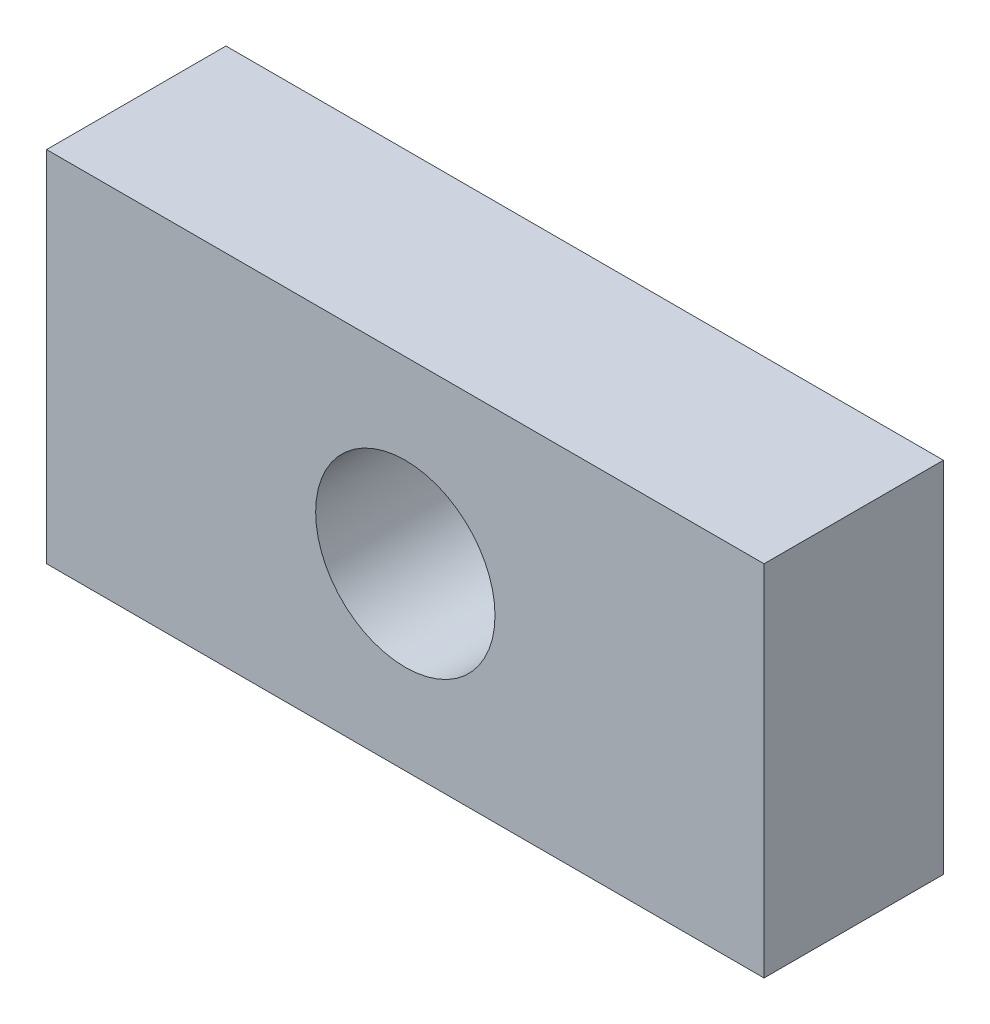
ISO-10303-21;
HEADER;
FILE_DESCRIPTION(('STEP AP214'),'2;1');
FILE_NAME('part.step','',(''),(''),'','','');
FILE_SCHEMA(('AUTOMOTIVE_DESIGN { 1 0 10303 214 1 1 1 1 }'));
ENDSEC;
DATA;
#1=APPLICATION_CONTEXT('core data for automotive mechanical design processes');
#2=APPLICATION_PROTOCOL_DEFINITION('international standard','automotive_design',2000,#1);
#3=PRODUCT_CONTEXT('',#1,'mechanical');
#4=PRODUCT('Part','Part','',(#3));
#5=PRODUCT_RELATED_PRODUCT_CATEGORY('part','',(#4));
#6=PRODUCT_DEFINITION_FORMATION('','',#4);
#7=PRODUCT_DEFINITION_CONTEXT('part definition',#1,'design');
#8=PRODUCT_DEFINITION('design','',#6,#7);
#9=PRODUCT_DEFINITION_SHAPE('','',#8);
#10=(LENGTH_UNIT() NAMED_UNIT(*) SI_UNIT(.MILLI.,.METRE.));
#11=(NAMED_UNIT(*) PLANE_ANGLE_UNIT() SI_UNIT($,.RADIAN.));
#12=(NAMED_UNIT(*) SI_UNIT($,.STERADIAN.) SOLID_ANGLE_UNIT());
#13=UNCERTAINTY_MEASURE_WITH_UNIT(LENGTH_MEASURE(1.E-05),#10,'distance_accuracy_value','');
#14=(GEOMETRIC_REPRESENTATION_CONTEXT(3) GLOBAL_UNCERTAINTY_ASSIGNED_CONTEXT((#13)) GLOBAL_UNIT_ASSIGNED_CONTEXT((#10,
#11,#12)) REPRESENTATION_CONTEXT('',''));
#15=CARTESIAN_POINT('',(0.,0.,0.));
#16=DIRECTION('',(0.,0.,1.));
#17=DIRECTION('',(1.,0.,0.));
#18=AXIS2_PLACEMENT_3D('',#15,#16,#17);
#19=CARTESIAN_POINT('',(0.,0.,10.));
#20=DIRECTION('',(1.,0.,0.));
#21=DIRECTION('',(0.,0.,-1.));
#22=AXIS2_PLACEMENT_3D('',#19,#20,#21);
#23=PLANE('',#22);
#24=DIRECTION('',(0.,-1.,0.));
#25=VECTOR('',#24,1.);
#26=CARTESIAN_POINT('',(0.,0.,0.));
#27=LINE('',#26,#25);
#28=CARTESIAN_POINT('',(0.,20.,0.));
#29=VERTEX_POINT('',#28);
#30=CARTESIAN_POINT('',(0.,0.,0.));
#31=VERTEX_POINT('',#30);
#32=EDGE_CURVE('E108',#29,#31,#27,.T.);
#33=ORIENTED_EDGE('',*,*,#32,.T.);
#34=DIRECTION('',(0.,0.,-1.));
#35=VECTOR('',#34,1.);
#36=CARTESIAN_POINT('',(0.,0.,10.));
#37=LINE('',#36,#35);
#38=CARTESIAN_POINT('',(0.,0.,10.));
#39=VERTEX_POINT('',#38);
#40=EDGE_CURVE('E11',#39,#31,#37,.T.);
#41=ORIENTED_EDGE('',*,*,#40,.F.);
#42=DIRECTION('',(0.,-1.,0.));
#43=VECTOR('',#42,1.);
#44=CARTESIAN_POINT('',(0.,0.,10.));
#45=LINE('',#44,#43);
#46=CARTESIAN_POINT('',(0.,20.,10.));
#47=VERTEX_POINT('',#46);
#48=EDGE_CURVE('E92',#47,#39,#45,.T.);
#49=ORIENTED_EDGE('',*,*,#48,.F.);
#50=DIRECTION('',(0.,0.,-1.));
#51=VECTOR('',#50,1.);
#52=CARTESIAN_POINT('',(0.,20.,10.));
#53=LINE('',#52,#51);
#54=EDGE_CURVE('E105',#47,#29,#53,.T.);
#55=ORIENTED_EDGE('',*,*,#54,.T.);
#56=EDGE_LOOP('',(#33,#41,#49,#55));
#57=FACE_BOUND('',#56,.T.);
#58=ADVANCED_FACE('F43',(#57),#23,.F.);
#59=CARTESIAN_POINT('',(0.,0.,10.));
#60=DIRECTION('',(0.,1.,0.));
#61=DIRECTION('',(0.,0.,1.));
#62=AXIS2_PLACEMENT_3D('',#59,#60,#61);
#63=PLANE('',#62);
#64=DIRECTION('',(1.,0.,0.));
#65=VECTOR('',#64,1.);
#66=CARTESIAN_POINT('',(0.,0.,0.));
#67=LINE('',#66,#65);
#68=CARTESIAN_POINT('',(40.,0.,0.));
#69=VERTEX_POINT('',#68);
#70=EDGE_CURVE('E97',#31,#69,#67,.T.);
#71=ORIENTED_EDGE('',*,*,#70,.T.);
#72=DIRECTION('',(0.,0.,-1.));
#73=VECTOR('',#72,1.);
#74=CARTESIAN_POINT('',(40.,0.,10.));
#75=LINE('',#74,#73);
#76=CARTESIAN_POINT('',(40.,0.,10.));
#77=VERTEX_POINT('',#76);
#78=EDGE_CURVE('E51',#77,#69,#75,.T.);
#79=ORIENTED_EDGE('',*,*,#78,.F.);
#80=DIRECTION('',(1.,0.,0.));
#81=VECTOR('',#80,1.);
#82=CARTESIAN_POINT('',(0.,0.,10.));
#83=LINE('',#82,#81);
#84=EDGE_CURVE('E87',#39,#77,#83,.T.);
#85=ORIENTED_EDGE('',*,*,#84,.F.);
#86=ORIENTED_EDGE('',*,*,#40,.T.);
#87=EDGE_LOOP('',(#71,#79,#85,#86));
#88=FACE_BOUND('',#87,.T.);
#89=ADVANCED_FACE('F100',(#88),#63,.F.);
#90=CARTESIAN_POINT('',(40.,0.,10.));
#91=DIRECTION('',(-1.,0.,0.));
#92=DIRECTION('',(0.,0.,1.));
#93=AXIS2_PLACEMENT_3D('',#90,#91,#92);
#94=PLANE('',#93);
#95=DIRECTION('',(0.,1.,0.));
#96=VECTOR('',#95,1.);
#97=CARTESIAN_POINT('',(40.,0.,0.));
#98=LINE('',#97,#96);
#99=CARTESIAN_POINT('',(40.,20.,0.));
#100=VERTEX_POINT('',#99);
#101=EDGE_CURVE('E78',#69,#100,#98,.T.);
#102=ORIENTED_EDGE('',*,*,#101,.T.);
#103=DIRECTION('',(0.,0.,-1.));
#104=VECTOR('',#103,1.);
#105=CARTESIAN_POINT('',(40.,20.,10.));
#106=LINE('',#105,#104);
#107=CARTESIAN_POINT('',(40.,20.,10.));
#108=VERTEX_POINT('',#107);
#109=EDGE_CURVE('E98',#108,#100,#106,.T.);
#110=ORIENTED_EDGE('',*,*,#109,.F.);
#111=DIRECTION('',(0.,1.,0.));
#112=VECTOR('',#111,1.);
#113=CARTESIAN_POINT('',(40.,0.,10.));
#114=LINE('',#113,#112);
#115=EDGE_CURVE('E95',#77,#108,#114,.T.);
#116=ORIENTED_EDGE('',*,*,#115,.F.);
#117=ORIENTED_EDGE('',*,*,#78,.T.);
#118=EDGE_LOOP('',(#102,#110,#116,#117));
#119=FACE_BOUND('',#118,.T.);
#120=ADVANCED_FACE('F99',(#119),#94,.F.);
#121=CARTESIAN_POINT('',(0.,20.,10.));
#122=DIRECTION('',(0.,-1.,0.));
#123=DIRECTION('',(0.,0.,-1.));
#124=AXIS2_PLACEMENT_3D('',#121,#122,#123);
#125=PLANE('',#124);
#126=DIRECTION('',(-1.,0.,0.));
#127=VECTOR('',#126,1.);
#128=CARTESIAN_POINT('',(0.,20.,0.));
#129=LINE('',#128,#127);
#130=EDGE_CURVE('E85',#100,#29,#129,.T.);
#131=ORIENTED_EDGE('',*,*,#130,.T.);
#132=ORIENTED_EDGE('',*,*,#54,.F.);
#133=DIRECTION('',(-1.,0.,0.));
#134=VECTOR('',#133,1.);
#135=CARTESIAN_POINT('',(0.,20.,10.));
#136=LINE('',#135,#134);
#137=EDGE_CURVE('E56',#108,#47,#136,.T.);
#138=ORIENTED_EDGE('',*,*,#137,.F.);
#139=ORIENTED_EDGE('',*,*,#109,.T.);
#140=EDGE_LOOP('',(#131,#132,#138,#139));
#141=FACE_BOUND('',#140,.T.);
#142=ADVANCED_FACE('F114',(#141),#125,.F.);
#143=CARTESIAN_POINT('',(0.,0.,10.));
#144=DIRECTION('',(0.,0.,-1.));
#145=DIRECTION('',(-1.,0.,0.));
#146=AXIS2_PLACEMENT_3D('',#143,#144,#145);
#147=PLANE('',#146);
#148=CARTESIAN_POINT('',(20.,10.,10.));
#149=DIRECTION('',(0.,0.,1.));
#150=DIRECTION('',(1.,0.,0.));
#151=AXIS2_PLACEMENT_3D('',#148,#149,#150);
#152=CIRCLE('',#151,5.);
#153=CARTESIAN_POINT('',(25.,10.,10.));
#154=VERTEX_POINT('',#153);
#155=EDGE_CURVE('E119',#154,#154,#152,.T.);
#156=ORIENTED_EDGE('',*,*,#155,.F.);
#157=EDGE_LOOP('',(#156));
#158=FACE_BOUND('',#157,.T.);
#159=ORIENTED_EDGE('',*,*,#48,.T.);
#160=ORIENTED_EDGE('',*,*,#84,.T.);
#161=ORIENTED_EDGE('',*,*,#115,.T.);
#162=ORIENTED_EDGE('',*,*,#137,.T.);
#163=EDGE_LOOP('',(#159,#160,#161,#162));
#164=FACE_BOUND('',#163,.T.);
#165=ADVANCED_FACE('F89',(#158,#164),#147,.F.);
#166=CARTESIAN_POINT('',(0.,0.,0.));
#167=DIRECTION('',(0.,0.,-1.));
#168=DIRECTION('',(-1.,0.,0.));
#169=AXIS2_PLACEMENT_3D('',#166,#167,#168);
#170=PLANE('',#169);
#171=CARTESIAN_POINT('',(20.,10.,0.));
#172=DIRECTION('',(0.,0.,1.));
#173=DIRECTION('',(1.,0.,0.));
#174=AXIS2_PLACEMENT_3D('',#171,#172,#173);
#175=CIRCLE('',#174,5.);
#176=CARTESIAN_POINT('',(25.,10.,0.));
#177=VERTEX_POINT('',#176);
#178=EDGE_CURVE('E107',#177,#177,#175,.T.);
#179=ORIENTED_EDGE('',*,*,#178,.T.);
#180=EDGE_LOOP('',(#179));
#181=FACE_BOUND('',#180,.T.);
#182=ORIENTED_EDGE('',*,*,#32,.F.);
#183=ORIENTED_EDGE('',*,*,#130,.F.);
#184=ORIENTED_EDGE('',*,*,#101,.F.);
#185=ORIENTED_EDGE('',*,*,#70,.F.);
#186=EDGE_LOOP('',(#182,#183,#184,#185));
#187=FACE_BOUND('',#186,.T.);
#188=ADVANCED_FACE('F120',(#181,#187),#170,.T.);
#189=CARTESIAN_POINT('',(20.,10.,0.));
#190=DIRECTION('',(0.,0.,1.));
#191=DIRECTION('',(1.,0.,0.));
#192=AXIS2_PLACEMENT_3D('',#189,#190,#191);
#193=CYLINDRICAL_SURFACE('',#192,5.);
#194=ORIENTED_EDGE('',*,*,#178,.F.);
#195=EDGE_LOOP('',(#194));
#196=FACE_BOUND('',#195,.T.);
#197=ORIENTED_EDGE('',*,*,#155,.T.);
#198=EDGE_LOOP('',(#197));
#199=FACE_BOUND('',#198,.T.);
#200=ADVANCED_FACE('F130',(#196,#199),#193,.F.);
#201=CLOSED_SHELL('',(#58,#89,#120,#142,#165,#188,#200));
#202=MANIFOLD_SOLID_BREP('B2',#201);
#203=ADVANCED_BREP_SHAPE_REPRESENTATION('',(#18,#202),#14);
#204=SHAPE_DEFINITION_REPRESENTATION(#9,#203);
ENDSEC;
END-ISO-10303-21;
